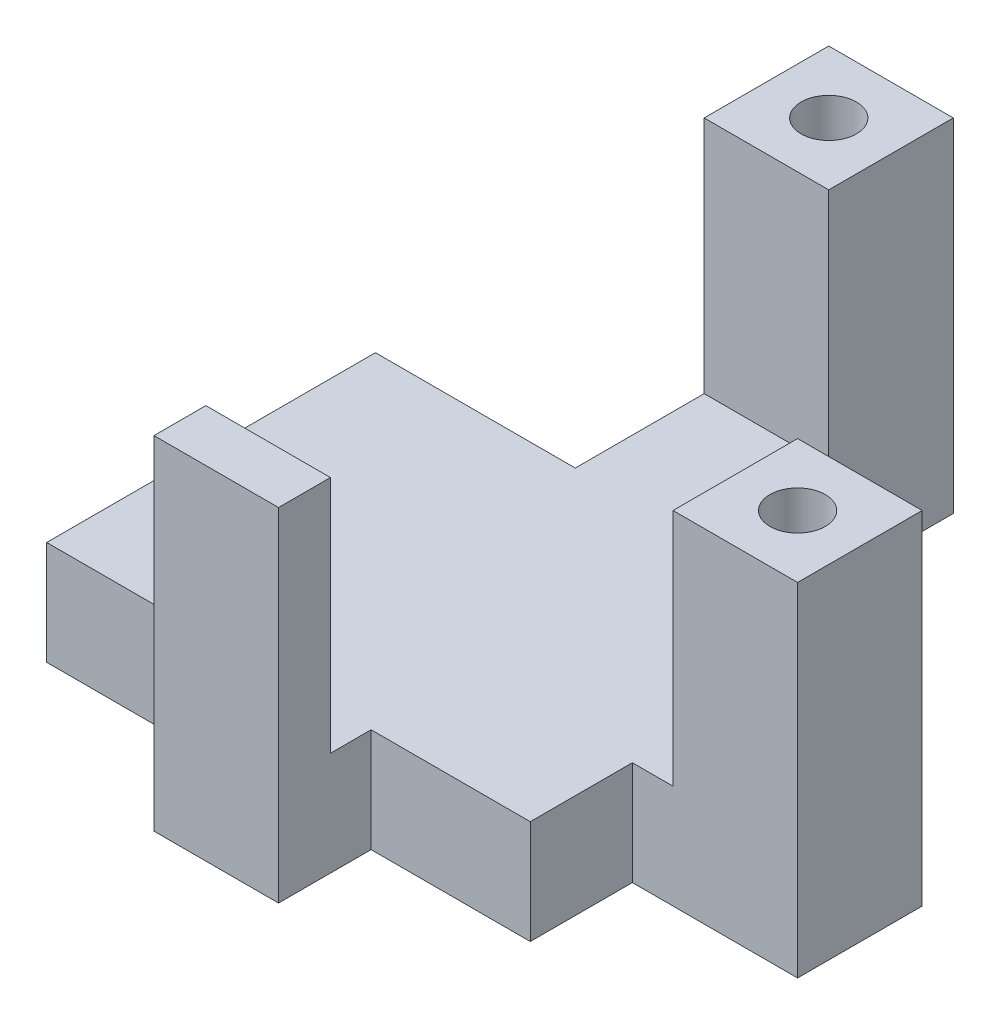
ISO-10303-21;
HEADER;
FILE_DESCRIPTION(('STEP AP214'),'2;1');
FILE_NAME('part.step','',(''),(''),'','','');
FILE_SCHEMA(('AUTOMOTIVE_DESIGN { 1 0 10303 214 1 1 1 1 }'));
ENDSEC;
DATA;
#1=APPLICATION_CONTEXT('core data for automotive mechanical design processes');
#2=APPLICATION_PROTOCOL_DEFINITION('international standard','automotive_design',2000,#1);
#3=PRODUCT_CONTEXT('',#1,'mechanical');
#4=PRODUCT('Part','Part','',(#3));
#5=PRODUCT_RELATED_PRODUCT_CATEGORY('part','',(#4));
#6=PRODUCT_DEFINITION_FORMATION('','',#4);
#7=PRODUCT_DEFINITION_CONTEXT('part definition',#1,'design');
#8=PRODUCT_DEFINITION('design','',#6,#7);
#9=PRODUCT_DEFINITION_SHAPE('','',#8);
#10=(LENGTH_UNIT() NAMED_UNIT(*) SI_UNIT(.MILLI.,.METRE.));
#11=(NAMED_UNIT(*) PLANE_ANGLE_UNIT() SI_UNIT($,.RADIAN.));
#12=(NAMED_UNIT(*) SI_UNIT($,.STERADIAN.) SOLID_ANGLE_UNIT());
#13=UNCERTAINTY_MEASURE_WITH_UNIT(LENGTH_MEASURE(1.E-05),#10,'distance_accuracy_value','');
#14=(GEOMETRIC_REPRESENTATION_CONTEXT(3) GLOBAL_UNCERTAINTY_ASSIGNED_CONTEXT((#13)) GLOBAL_UNIT_ASSIGNED_CONTEXT((#10,
#11,#12)) REPRESENTATION_CONTEXT('',''));
#15=CARTESIAN_POINT('',(0.,0.,0.));
#16=DIRECTION('',(0.,0.,1.));
#17=DIRECTION('',(1.,0.,0.));
#18=AXIS2_PLACEMENT_3D('',#15,#16,#17);
#19=CARTESIAN_POINT('',(34.75,-16.8,0.));
#20=DIRECTION('',(0.,-1.,0.));
#21=DIRECTION('',(1.,0.,0.));
#22=AXIS2_PLACEMENT_3D('',#19,#20,#21);
#23=PLANE('',#22);
#24=DIRECTION('',(0.,0.,1.));
#25=VECTOR('',#24,1.);
#26=CARTESIAN_POINT('',(65.05,-16.8,5.9));
#27=LINE('',#26,#25);
#28=CARTESIAN_POINT('',(65.05,-16.8,5.9));
#29=VERTEX_POINT('',#28);
#30=CARTESIAN_POINT('',(65.05,-16.8,13.1));
#31=VERTEX_POINT('',#30);
#32=EDGE_CURVE('E193',#29,#31,#27,.T.);
#33=ORIENTED_EDGE('',*,*,#32,.F.);
#34=DIRECTION('',(-1.,0.,0.));
#35=VECTOR('',#34,1.);
#36=CARTESIAN_POINT('',(72.25,-16.8,5.9));
#37=LINE('',#36,#35);
#38=CARTESIAN_POINT('',(62.7,-16.8,5.9));
#39=VERTEX_POINT('',#38);
#40=EDGE_CURVE('E228',#29,#39,#37,.T.);
#41=ORIENTED_EDGE('',*,*,#40,.T.);
#42=DIRECTION('',(0.,0.,1.));
#43=VECTOR('',#42,1.);
#44=CARTESIAN_POINT('',(62.7,-16.8,19.));
#45=LINE('',#44,#43);
#46=CARTESIAN_POINT('',(62.7,-16.8,0.));
#47=VERTEX_POINT('',#46);
#48=EDGE_CURVE('E244',#47,#39,#45,.T.);
#49=ORIENTED_EDGE('',*,*,#48,.F.);
#50=DIRECTION('',(1.,0.,0.));
#51=VECTOR('',#50,1.);
#52=CARTESIAN_POINT('',(34.75,-16.8,0.));
#53=LINE('',#52,#51);
#54=CARTESIAN_POINT('',(53.5,-16.8,0.));
#55=VERTEX_POINT('',#54);
#56=EDGE_CURVE('E44',#55,#47,#53,.T.);
#57=ORIENTED_EDGE('',*,*,#56,.F.);
#58=DIRECTION('',(0.,0.,1.));
#59=VECTOR('',#58,1.);
#60=CARTESIAN_POINT('',(53.5,-16.8,0.));
#61=LINE('',#60,#59);
#62=CARTESIAN_POINT('',(53.5,-16.8,-7.45));
#63=VERTEX_POINT('',#62);
#64=EDGE_CURVE('E267',#63,#55,#61,.T.);
#65=ORIENTED_EDGE('',*,*,#64,.F.);
#66=DIRECTION('',(1.,0.,0.));
#67=VECTOR('',#66,1.);
#68=CARTESIAN_POINT('',(48.4,-16.8,-7.45));
#69=LINE('',#68,#67);
#70=CARTESIAN_POINT('',(46.3,-16.8,-7.45));
#71=VERTEX_POINT('',#70);
#72=EDGE_CURVE('E330',#71,#63,#69,.T.);
#73=ORIENTED_EDGE('',*,*,#72,.F.);
#74=DIRECTION('',(0.,0.,-1.));
#75=VECTOR('',#74,1.);
#76=CARTESIAN_POINT('',(46.3,-16.8,0.));
#77=LINE('',#76,#75);
#78=CARTESIAN_POINT('',(46.3,-16.8,0.));
#79=VERTEX_POINT('',#78);
#80=EDGE_CURVE('E316',#79,#71,#77,.T.);
#81=ORIENTED_EDGE('',*,*,#80,.F.);
#82=CARTESIAN_POINT('',(34.75,-16.8,0.));
#83=VERTEX_POINT('',#82);
#84=EDGE_CURVE('E11',#83,#79,#53,.T.);
#85=ORIENTED_EDGE('',*,*,#84,.F.);
#86=DIRECTION('',(0.,0.,-1.));
#87=VECTOR('',#86,1.);
#88=CARTESIAN_POINT('',(34.75,-16.8,0.));
#89=LINE('',#88,#87);
#90=CARTESIAN_POINT('',(34.75,-16.8,19.));
#91=VERTEX_POINT('',#90);
#92=EDGE_CURVE('E351',#91,#83,#89,.T.);
#93=ORIENTED_EDGE('',*,*,#92,.F.);
#94=DIRECTION('',(-1.,0.,0.));
#95=VECTOR('',#94,1.);
#96=CARTESIAN_POINT('',(34.75,-16.8,19.));
#97=LINE('',#96,#95);
#98=CARTESIAN_POINT('',(46.3,-16.8,19.));
#99=VERTEX_POINT('',#98);
#100=EDGE_CURVE('E344',#99,#91,#97,.T.);
#101=ORIENTED_EDGE('',*,*,#100,.F.);
#102=DIRECTION('',(0.,0.,-1.));
#103=VECTOR('',#102,1.);
#104=CARTESIAN_POINT('',(46.3,-16.8,21.35));
#105=LINE('',#104,#103);
#106=CARTESIAN_POINT('',(46.3,-16.8,21.35));
#107=VERTEX_POINT('',#106);
#108=EDGE_CURVE('E300',#107,#99,#105,.T.);
#109=ORIENTED_EDGE('',*,*,#108,.F.);
#110=DIRECTION('',(-1.,0.,0.));
#111=VECTOR('',#110,1.);
#112=CARTESIAN_POINT('',(48.4,-16.8,21.35));
#113=LINE('',#112,#111);
#114=CARTESIAN_POINT('',(53.5,-16.8,21.35));
#115=VERTEX_POINT('',#114);
#116=EDGE_CURVE('E324',#115,#107,#113,.T.);
#117=ORIENTED_EDGE('',*,*,#116,.F.);
#118=DIRECTION('',(0.,0.,1.));
#119=VECTOR('',#118,1.);
#120=CARTESIAN_POINT('',(53.5,-16.8,19.));
#121=LINE('',#120,#119);
#122=CARTESIAN_POINT('',(53.5,-16.8,19.));
#123=VERTEX_POINT('',#122);
#124=EDGE_CURVE('E288',#123,#115,#121,.T.);
#125=ORIENTED_EDGE('',*,*,#124,.F.);
#126=CARTESIAN_POINT('',(62.7,-16.8,19.));
#127=VERTEX_POINT('',#126);
#128=EDGE_CURVE('E345',#127,#123,#97,.T.);
#129=ORIENTED_EDGE('',*,*,#128,.F.);
#130=CARTESIAN_POINT('',(62.7,-16.8,13.1));
#131=VERTEX_POINT('',#130);
#132=EDGE_CURVE('E243',#131,#127,#45,.T.);
#133=ORIENTED_EDGE('',*,*,#132,.F.);
#134=DIRECTION('',(-1.,0.,0.));
#135=VECTOR('',#134,1.);
#136=CARTESIAN_POINT('',(72.25,-16.8,13.1));
#137=LINE('',#136,#135);
#138=EDGE_CURVE('E51',#31,#131,#137,.T.);
#139=ORIENTED_EDGE('',*,*,#138,.F.);
#140=EDGE_LOOP('',(#33,#41,#49,#57,#65,#73,#81,#85,#93,#101,#109,#117,#125,#129,#133,#139));
#141=FACE_BOUND('',#140,.T.);
#142=ADVANCED_FACE('F36',(#141),#23,.F.);
#143=CARTESIAN_POINT('',(62.7,0.,0.));
#144=DIRECTION('',(1.,0.,0.));
#145=DIRECTION('',(0.,0.,-1.));
#146=AXIS2_PLACEMENT_3D('',#143,#144,#145);
#147=PLANE('',#146);
#148=DIRECTION('',(0.,-1.,0.));
#149=VECTOR('',#148,1.);
#150=CARTESIAN_POINT('',(62.7,-16.8,13.1));
#151=LINE('',#150,#149);
#152=CARTESIAN_POINT('',(62.7,-22.8,13.1));
#153=VERTEX_POINT('',#152);
#154=EDGE_CURVE('E210',#131,#153,#151,.T.);
#155=ORIENTED_EDGE('',*,*,#154,.F.);
#156=ORIENTED_EDGE('',*,*,#132,.T.);
#157=DIRECTION('',(0.,-1.,0.));
#158=VECTOR('',#157,1.);
#159=CARTESIAN_POINT('',(62.7,-16.8,19.));
#160=LINE('',#159,#158);
#161=CARTESIAN_POINT('',(62.7,-22.8,19.));
#162=VERTEX_POINT('',#161);
#163=EDGE_CURVE('E236',#127,#162,#160,.T.);
#164=ORIENTED_EDGE('',*,*,#163,.T.);
#165=DIRECTION('',(0.,0.,-1.));
#166=VECTOR('',#165,1.);
#167=CARTESIAN_POINT('',(62.7,-22.8,19.));
#168=LINE('',#167,#166);
#169=EDGE_CURVE('E239',#162,#153,#168,.T.);
#170=ORIENTED_EDGE('',*,*,#169,.T.);
#171=EDGE_LOOP('',(#155,#156,#164,#170));
#172=FACE_BOUND('',#171,.T.);
#173=ADVANCED_FACE('F429',(#172),#147,.T.);
#174=CARTESIAN_POINT('',(0.,0.,0.));
#175=DIRECTION('',(0.,0.,-1.));
#176=DIRECTION('',(-1.,0.,0.));
#177=AXIS2_PLACEMENT_3D('',#174,#175,#176);
#178=PLANE('',#177);
#179=ORIENTED_EDGE('',*,*,#56,.T.);
#180=DIRECTION('',(0.,1.,0.));
#181=VECTOR('',#180,1.);
#182=CARTESIAN_POINT('',(62.7,-16.8,0.));
#183=LINE('',#182,#181);
#184=CARTESIAN_POINT('',(62.7,-22.8,0.));
#185=VERTEX_POINT('',#184);
#186=EDGE_CURVE('E241',#185,#47,#183,.T.);
#187=ORIENTED_EDGE('',*,*,#186,.F.);
#188=DIRECTION('',(1.,0.,0.));
#189=VECTOR('',#188,1.);
#190=CARTESIAN_POINT('',(34.75,-22.8,0.));
#191=LINE('',#190,#189);
#192=CARTESIAN_POINT('',(53.5,-22.8,0.));
#193=VERTEX_POINT('',#192);
#194=EDGE_CURVE('E337',#193,#185,#191,.T.);
#195=ORIENTED_EDGE('',*,*,#194,.F.);
#196=DIRECTION('',(0.,-1.,0.));
#197=VECTOR('',#196,1.);
#198=CARTESIAN_POINT('',(53.5,-22.8,0.));
#199=LINE('',#198,#197);
#200=EDGE_CURVE('E269',#55,#193,#199,.T.);
#201=ORIENTED_EDGE('',*,*,#200,.F.);
#202=EDGE_LOOP('',(#179,#187,#195,#201));
#203=FACE_BOUND('',#202,.T.);
#204=ADVANCED_FACE('F361',(#203),#178,.T.);
#205=CARTESIAN_POINT('',(0.,0.,19.));
#206=DIRECTION('',(0.,0.,-1.));
#207=DIRECTION('',(-1.,0.,0.));
#208=AXIS2_PLACEMENT_3D('',#205,#206,#207);
#209=PLANE('',#208);
#210=ORIENTED_EDGE('',*,*,#163,.F.);
#211=ORIENTED_EDGE('',*,*,#128,.T.);
#212=DIRECTION('',(0.,1.,0.));
#213=VECTOR('',#212,1.);
#214=CARTESIAN_POINT('',(53.5,-22.8,19.));
#215=LINE('',#214,#213);
#216=CARTESIAN_POINT('',(53.5,-22.8,19.));
#217=VERTEX_POINT('',#216);
#218=EDGE_CURVE('E285',#217,#123,#215,.T.);
#219=ORIENTED_EDGE('',*,*,#218,.F.);
#220=DIRECTION('',(-1.,0.,0.));
#221=VECTOR('',#220,1.);
#222=CARTESIAN_POINT('',(34.75,-22.8,19.));
#223=LINE('',#222,#221);
#224=EDGE_CURVE('E342',#162,#217,#223,.T.);
#225=ORIENTED_EDGE('',*,*,#224,.F.);
#226=EDGE_LOOP('',(#210,#211,#219,#225));
#227=FACE_BOUND('',#226,.T.);
#228=ADVANCED_FACE('F425',(#227),#209,.F.);
#229=CARTESIAN_POINT('',(0.,-22.8,0.));
#230=DIRECTION('',(0.,-1.,0.));
#231=DIRECTION('',(1.,0.,0.));
#232=AXIS2_PLACEMENT_3D('',#229,#230,#231);
#233=PLANE('',#232);
#234=CARTESIAN_POINT('',(68.65,-22.8,9.5));
#235=DIRECTION('',(0.,-1.,0.));
#236=DIRECTION('',(1.,0.,0.));
#237=AXIS2_PLACEMENT_3D('',#234,#235,#236);
#238=CIRCLE('',#237,1.6);
#239=CARTESIAN_POINT('',(68.65,-22.8,11.1));
#240=VERTEX_POINT('',#239);
#241=EDGE_CURVE('E219',#240,#240,#238,.F.);
#242=ORIENTED_EDGE('',*,*,#241,.T.);
#243=EDGE_LOOP('',(#242));
#244=FACE_BOUND('',#243,.T.);
#245=CARTESIAN_POINT('',(49.9,-22.8,-11.05));
#246=DIRECTION('',(0.,-1.,0.));
#247=DIRECTION('',(1.,0.,0.));
#248=AXIS2_PLACEMENT_3D('',#245,#246,#247);
#249=CIRCLE('',#248,1.6);
#250=CARTESIAN_POINT('',(51.5,-22.8,-11.05));
#251=VERTEX_POINT('',#250);
#252=EDGE_CURVE('E246',#251,#251,#249,.T.);
#253=ORIENTED_EDGE('',*,*,#252,.F.);
#254=EDGE_LOOP('',(#253));
#255=FACE_BOUND('',#254,.T.);
#256=ORIENTED_EDGE('',*,*,#194,.T.);
#257=CARTESIAN_POINT('',(62.7,-22.8,5.9));
#258=VERTEX_POINT('',#257);
#259=EDGE_CURVE('E238',#258,#185,#168,.T.);
#260=ORIENTED_EDGE('',*,*,#259,.F.);
#261=DIRECTION('',(-1.,0.,0.));
#262=VECTOR('',#261,1.);
#263=CARTESIAN_POINT('',(72.25,-22.8,5.9));
#264=LINE('',#263,#262);
#265=CARTESIAN_POINT('',(72.25,-22.8,5.9));
#266=VERTEX_POINT('',#265);
#267=EDGE_CURVE('E230',#266,#258,#264,.T.);
#268=ORIENTED_EDGE('',*,*,#267,.F.);
#269=DIRECTION('',(0.,0.,-1.));
#270=VECTOR('',#269,1.);
#271=CARTESIAN_POINT('',(72.25,-22.8,13.1));
#272=LINE('',#271,#270);
#273=CARTESIAN_POINT('',(72.25,-22.8,13.1));
#274=VERTEX_POINT('',#273);
#275=EDGE_CURVE('E222',#274,#266,#272,.T.);
#276=ORIENTED_EDGE('',*,*,#275,.F.);
#277=DIRECTION('',(-1.,0.,0.));
#278=VECTOR('',#277,1.);
#279=CARTESIAN_POINT('',(72.25,-22.8,13.1));
#280=LINE('',#279,#278);
#281=EDGE_CURVE('E233',#274,#153,#280,.T.);
#282=ORIENTED_EDGE('',*,*,#281,.T.);
#283=ORIENTED_EDGE('',*,*,#169,.F.);
#284=ORIENTED_EDGE('',*,*,#224,.T.);
#285=DIRECTION('',(0.,0.,-1.));
#286=VECTOR('',#285,1.);
#287=CARTESIAN_POINT('',(53.5,-22.8,24.35));
#288=LINE('',#287,#286);
#289=CARTESIAN_POINT('',(53.5,-22.8,24.35));
#290=VERTEX_POINT('',#289);
#291=EDGE_CURVE('E282',#290,#217,#288,.T.);
#292=ORIENTED_EDGE('',*,*,#291,.F.);
#293=DIRECTION('',(1.,0.,0.));
#294=VECTOR('',#293,1.);
#295=CARTESIAN_POINT('',(48.4,-22.8,24.35));
#296=LINE('',#295,#294);
#297=CARTESIAN_POINT('',(46.3,-22.8,24.35));
#298=VERTEX_POINT('',#297);
#299=EDGE_CURVE('E328',#298,#290,#296,.T.);
#300=ORIENTED_EDGE('',*,*,#299,.F.);
#301=DIRECTION('',(0.,0.,1.));
#302=VECTOR('',#301,1.);
#303=CARTESIAN_POINT('',(46.3,-22.8,19.));
#304=LINE('',#303,#302);
#305=CARTESIAN_POINT('',(46.3,-22.8,19.));
#306=VERTEX_POINT('',#305);
#307=EDGE_CURVE('E304',#306,#298,#304,.T.);
#308=ORIENTED_EDGE('',*,*,#307,.F.);
#309=CARTESIAN_POINT('',(34.75,-22.8,19.));
#310=VERTEX_POINT('',#309);
#311=EDGE_CURVE('E341',#306,#310,#223,.T.);
#312=ORIENTED_EDGE('',*,*,#311,.T.);
#313=DIRECTION('',(0.,0.,-1.));
#314=VECTOR('',#313,1.);
#315=CARTESIAN_POINT('',(34.75,-22.8,19.));
#316=LINE('',#315,#314);
#317=CARTESIAN_POINT('',(34.75,-22.8,0.));
#318=VERTEX_POINT('',#317);
#319=EDGE_CURVE('E334',#310,#318,#316,.T.);
#320=ORIENTED_EDGE('',*,*,#319,.T.);
#321=CARTESIAN_POINT('',(46.3,-22.8,0.));
#322=VERTEX_POINT('',#321);
#323=EDGE_CURVE('E338',#318,#322,#191,.T.);
#324=ORIENTED_EDGE('',*,*,#323,.T.);
#325=DIRECTION('',(0.,0.,1.));
#326=VECTOR('',#325,1.);
#327=CARTESIAN_POINT('',(46.3,-22.8,-10.45));
#328=LINE('',#327,#326);
#329=CARTESIAN_POINT('',(46.3,-22.8,-14.65));
#330=VERTEX_POINT('',#329);
#331=EDGE_CURVE('E312',#330,#322,#328,.T.);
#332=ORIENTED_EDGE('',*,*,#331,.F.);
#333=DIRECTION('',(-1.,0.,0.));
#334=VECTOR('',#333,1.);
#335=CARTESIAN_POINT('',(53.5,-22.8,-14.65));
#336=LINE('',#335,#334);
#337=CARTESIAN_POINT('',(53.5,-22.8,-14.65));
#338=VERTEX_POINT('',#337);
#339=EDGE_CURVE('E255',#338,#330,#336,.T.);
#340=ORIENTED_EDGE('',*,*,#339,.F.);
#341=DIRECTION('',(0.,0.,-1.));
#342=VECTOR('',#341,1.);
#343=CARTESIAN_POINT('',(53.5,-22.8,-10.45));
#344=LINE('',#343,#342);
#345=EDGE_CURVE('E271',#193,#338,#344,.T.);
#346=ORIENTED_EDGE('',*,*,#345,.F.);
#347=EDGE_LOOP('',(#256,#260,#268,#276,#282,#283,#284,#292,#300,#308,#312,#320,#324,#332,#340,#346));
#348=FACE_BOUND('',#347,.T.);
#349=ADVANCED_FACE('F374',(#244,#255,#348),#233,.T.);
#350=CARTESIAN_POINT('',(0.,0.,24.35));
#351=DIRECTION('',(0.,0.,1.));
#352=DIRECTION('',(1.,0.,0.));
#353=AXIS2_PLACEMENT_3D('',#350,#351,#352);
#354=PLANE('',#353);
#355=ORIENTED_EDGE('',*,*,#299,.T.);
#356=DIRECTION('',(0.,-1.,0.));
#357=VECTOR('',#356,1.);
#358=CARTESIAN_POINT('',(53.5,-3.,24.35));
#359=LINE('',#358,#357);
#360=CARTESIAN_POINT('',(53.5,-3.,24.35));
#361=VERTEX_POINT('',#360);
#362=EDGE_CURVE('E279',#361,#290,#359,.T.);
#363=ORIENTED_EDGE('',*,*,#362,.F.);
#364=DIRECTION('',(1.,0.,0.));
#365=VECTOR('',#364,1.);
#366=CARTESIAN_POINT('',(48.4,-3.,24.35));
#367=LINE('',#366,#365);
#368=CARTESIAN_POINT('',(46.3,-3.,24.35));
#369=VERTEX_POINT('',#368);
#370=EDGE_CURVE('E322',#369,#361,#367,.T.);
#371=ORIENTED_EDGE('',*,*,#370,.F.);
#372=DIRECTION('',(0.,1.,0.));
#373=VECTOR('',#372,1.);
#374=CARTESIAN_POINT('',(46.3,-22.8,24.35));
#375=LINE('',#374,#373);
#376=EDGE_CURVE('E307',#298,#369,#375,.T.);
#377=ORIENTED_EDGE('',*,*,#376,.F.);
#378=EDGE_LOOP('',(#355,#363,#371,#377));
#379=FACE_BOUND('',#378,.T.);
#380=ADVANCED_FACE('F418',(#379),#354,.T.);
#381=ORIENTED_EDGE('',*,*,#311,.F.);
#382=DIRECTION('',(0.,-1.,0.));
#383=VECTOR('',#382,1.);
#384=CARTESIAN_POINT('',(46.3,-16.8,19.));
#385=LINE('',#384,#383);
#386=EDGE_CURVE('E302',#99,#306,#385,.T.);
#387=ORIENTED_EDGE('',*,*,#386,.F.);
#388=ORIENTED_EDGE('',*,*,#100,.T.);
#389=DIRECTION('',(0.,-1.,0.));
#390=VECTOR('',#389,1.);
#391=CARTESIAN_POINT('',(34.75,-19.8,19.));
#392=LINE('',#391,#390);
#393=EDGE_CURVE('E347',#91,#310,#392,.T.);
#394=ORIENTED_EDGE('',*,*,#393,.T.);
#395=EDGE_LOOP('',(#381,#387,#388,#394));
#396=FACE_BOUND('',#395,.T.);
#397=ADVANCED_FACE('F398',(#396),#209,.F.);
#398=DIRECTION('',(0.,1.,0.));
#399=VECTOR('',#398,1.);
#400=CARTESIAN_POINT('',(46.3,-22.8,0.));
#401=LINE('',#400,#399);
#402=EDGE_CURVE('E314',#322,#79,#401,.T.);
#403=ORIENTED_EDGE('',*,*,#402,.F.);
#404=ORIENTED_EDGE('',*,*,#323,.F.);
#405=DIRECTION('',(0.,-1.,0.));
#406=VECTOR('',#405,1.);
#407=CARTESIAN_POINT('',(34.75,-19.8,0.));
#408=LINE('',#407,#406);
#409=EDGE_CURVE('E350',#83,#318,#408,.T.);
#410=ORIENTED_EDGE('',*,*,#409,.F.);
#411=ORIENTED_EDGE('',*,*,#84,.T.);
#412=EDGE_LOOP('',(#403,#404,#410,#411));
#413=FACE_BOUND('',#412,.T.);
#414=ADVANCED_FACE('F38',(#413),#178,.T.);
#415=CARTESIAN_POINT('',(34.75,0.,0.));
#416=DIRECTION('',(1.,0.,0.));
#417=DIRECTION('',(0.,0.,-1.));
#418=AXIS2_PLACEMENT_3D('',#415,#416,#417);
#419=PLANE('',#418);
#420=ORIENTED_EDGE('',*,*,#409,.T.);
#421=ORIENTED_EDGE('',*,*,#319,.F.);
#422=ORIENTED_EDGE('',*,*,#393,.F.);
#423=ORIENTED_EDGE('',*,*,#92,.T.);
#424=EDGE_LOOP('',(#420,#421,#422,#423));
#425=FACE_BOUND('',#424,.T.);
#426=ADVANCED_FACE('F396',(#425),#419,.F.);
#427=CARTESIAN_POINT('',(48.4,1.24264068711929,-7.45));
#428=DIRECTION('',(0.,0.,-1.));
#429=DIRECTION('',(-1.,0.,0.));
#430=AXIS2_PLACEMENT_3D('',#427,#428,#429);
#431=PLANE('',#430);
#432=DIRECTION('',(1.,0.,0.));
#433=VECTOR('',#432,1.);
#434=CARTESIAN_POINT('',(48.4,-3.,-7.45));
#435=LINE('',#434,#433);
#436=CARTESIAN_POINT('',(46.3,-3.,-7.45));
#437=VERTEX_POINT('',#436);
#438=CARTESIAN_POINT('',(53.5,-3.,-7.45));
#439=VERTEX_POINT('',#438);
#440=EDGE_CURVE('E332',#437,#439,#435,.T.);
#441=ORIENTED_EDGE('',*,*,#440,.F.);
#442=DIRECTION('',(0.,1.,0.));
#443=VECTOR('',#442,1.);
#444=CARTESIAN_POINT('',(46.3,-16.8,-7.45));
#445=LINE('',#444,#443);
#446=EDGE_CURVE('E319',#71,#437,#445,.T.);
#447=ORIENTED_EDGE('',*,*,#446,.F.);
#448=ORIENTED_EDGE('',*,*,#72,.T.);
#449=DIRECTION('',(0.,-1.,0.));
#450=VECTOR('',#449,1.);
#451=CARTESIAN_POINT('',(53.5,-16.8,-7.45));
#452=LINE('',#451,#450);
#453=EDGE_CURVE('E264',#439,#63,#452,.T.);
#454=ORIENTED_EDGE('',*,*,#453,.F.);
#455=EDGE_LOOP('',(#441,#447,#448,#454));
#456=FACE_BOUND('',#455,.T.);
#457=ADVANCED_FACE('F382',(#456),#431,.F.);
#458=CARTESIAN_POINT('',(48.4,1.24264068711928,21.35));
#459=DIRECTION('',(0.,0.,1.));
#460=DIRECTION('',(1.,0.,0.));
#461=AXIS2_PLACEMENT_3D('',#458,#459,#460);
#462=PLANE('',#461);
#463=DIRECTION('',(-1.,0.,0.));
#464=VECTOR('',#463,1.);
#465=CARTESIAN_POINT('',(48.4,-3.,21.35));
#466=LINE('',#465,#464);
#467=CARTESIAN_POINT('',(53.5,-3.,21.35));
#468=VERTEX_POINT('',#467);
#469=CARTESIAN_POINT('',(46.3,-3.,21.35));
#470=VERTEX_POINT('',#469);
#471=EDGE_CURVE('E326',#468,#470,#466,.T.);
#472=ORIENTED_EDGE('',*,*,#471,.F.);
#473=DIRECTION('',(0.,1.,0.));
#474=VECTOR('',#473,1.);
#475=CARTESIAN_POINT('',(53.5,-16.8,21.35));
#476=LINE('',#475,#474);
#477=EDGE_CURVE('E291',#115,#468,#476,.T.);
#478=ORIENTED_EDGE('',*,*,#477,.F.);
#479=ORIENTED_EDGE('',*,*,#116,.T.);
#480=DIRECTION('',(0.,-1.,0.));
#481=VECTOR('',#480,1.);
#482=CARTESIAN_POINT('',(46.3,-3.,21.35));
#483=LINE('',#482,#481);
#484=EDGE_CURVE('E297',#470,#107,#483,.T.);
#485=ORIENTED_EDGE('',*,*,#484,.F.);
#486=EDGE_LOOP('',(#472,#478,#479,#485));
#487=FACE_BOUND('',#486,.T.);
#488=ADVANCED_FACE('F408',(#487),#462,.F.);
#489=CARTESIAN_POINT('',(0.,-3.,0.));
#490=DIRECTION('',(0.,1.,0.));
#491=DIRECTION('',(0.,0.,1.));
#492=AXIS2_PLACEMENT_3D('',#489,#490,#491);
#493=PLANE('',#492);
#494=ORIENTED_EDGE('',*,*,#471,.T.);
#495=DIRECTION('',(0.,0.,-1.));
#496=VECTOR('',#495,1.);
#497=CARTESIAN_POINT('',(46.3,-3.,24.35));
#498=LINE('',#497,#496);
#499=EDGE_CURVE('E294',#369,#470,#498,.T.);
#500=ORIENTED_EDGE('',*,*,#499,.F.);
#501=ORIENTED_EDGE('',*,*,#370,.T.);
#502=DIRECTION('',(0.,0.,1.));
#503=VECTOR('',#502,1.);
#504=CARTESIAN_POINT('',(53.5,-3.,21.35));
#505=LINE('',#504,#503);
#506=EDGE_CURVE('E276',#468,#361,#505,.T.);
#507=ORIENTED_EDGE('',*,*,#506,.F.);
#508=EDGE_LOOP('',(#494,#500,#501,#507));
#509=FACE_BOUND('',#508,.T.);
#510=ADVANCED_FACE('F414',(#509),#493,.T.);
#511=CARTESIAN_POINT('',(0.,-3.,0.));
#512=DIRECTION('',(0.,1.,0.));
#513=DIRECTION('',(0.,0.,1.));
#514=AXIS2_PLACEMENT_3D('',#511,#512,#513);
#515=PLANE('',#514);
#516=CARTESIAN_POINT('',(49.9,-3.,-11.05));
#517=DIRECTION('',(0.,-1.,0.));
#518=DIRECTION('',(1.,0.,0.));
#519=AXIS2_PLACEMENT_3D('',#516,#517,#518);
#520=CIRCLE('',#519,1.6);
#521=CARTESIAN_POINT('',(51.5,-3.,-11.05));
#522=VERTEX_POINT('',#521);
#523=EDGE_CURVE('E247',#522,#522,#520,.T.);
#524=ORIENTED_EDGE('',*,*,#523,.T.);
#525=EDGE_LOOP('',(#524));
#526=FACE_BOUND('',#525,.T.);
#527=ORIENTED_EDGE('',*,*,#440,.T.);
#528=DIRECTION('',(0.,0.,1.));
#529=VECTOR('',#528,1.);
#530=CARTESIAN_POINT('',(53.5,-3.,-7.45));
#531=LINE('',#530,#529);
#532=CARTESIAN_POINT('',(53.5,-3.,-14.65));
#533=VERTEX_POINT('',#532);
#534=EDGE_CURVE('E273',#533,#439,#531,.T.);
#535=ORIENTED_EDGE('',*,*,#534,.F.);
#536=DIRECTION('',(1.,0.,0.));
#537=VECTOR('',#536,1.);
#538=CARTESIAN_POINT('',(53.5,-3.,-14.65));
#539=LINE('',#538,#537);
#540=CARTESIAN_POINT('',(46.3,-3.,-14.65));
#541=VERTEX_POINT('',#540);
#542=EDGE_CURVE('E261',#541,#533,#539,.T.);
#543=ORIENTED_EDGE('',*,*,#542,.F.);
#544=DIRECTION('',(0.,0.,-1.));
#545=VECTOR('',#544,1.);
#546=CARTESIAN_POINT('',(46.3,-3.,-7.45));
#547=LINE('',#546,#545);
#548=EDGE_CURVE('E310',#437,#541,#547,.T.);
#549=ORIENTED_EDGE('',*,*,#548,.F.);
#550=EDGE_LOOP('',(#527,#535,#543,#549));
#551=FACE_BOUND('',#550,.T.);
#552=ADVANCED_FACE('F462',(#526,#551),#515,.T.);
#553=CARTESIAN_POINT('',(46.3,0.,0.));
#554=DIRECTION('',(-1.,0.,0.));
#555=DIRECTION('',(0.,0.,1.));
#556=AXIS2_PLACEMENT_3D('',#553,#554,#555);
#557=PLANE('',#556);
#558=ORIENTED_EDGE('',*,*,#548,.T.);
#559=DIRECTION('',(0.,1.,0.));
#560=VECTOR('',#559,1.);
#561=CARTESIAN_POINT('',(46.3,-3.,-14.65));
#562=LINE('',#561,#560);
#563=EDGE_CURVE('E258',#330,#541,#562,.T.);
#564=ORIENTED_EDGE('',*,*,#563,.F.);
#565=ORIENTED_EDGE('',*,*,#331,.T.);
#566=ORIENTED_EDGE('',*,*,#402,.T.);
#567=ORIENTED_EDGE('',*,*,#80,.T.);
#568=ORIENTED_EDGE('',*,*,#446,.T.);
#569=EDGE_LOOP('',(#558,#564,#565,#566,#567,#568));
#570=FACE_BOUND('',#569,.T.);
#571=ADVANCED_FACE('F386',(#570),#557,.T.);
#572=CARTESIAN_POINT('',(46.3,0.,0.));
#573=DIRECTION('',(-1.,0.,0.));
#574=DIRECTION('',(0.,0.,1.));
#575=AXIS2_PLACEMENT_3D('',#572,#573,#574);
#576=PLANE('',#575);
#577=ORIENTED_EDGE('',*,*,#499,.T.);
#578=ORIENTED_EDGE('',*,*,#484,.T.);
#579=ORIENTED_EDGE('',*,*,#108,.T.);
#580=ORIENTED_EDGE('',*,*,#386,.T.);
#581=ORIENTED_EDGE('',*,*,#307,.T.);
#582=ORIENTED_EDGE('',*,*,#376,.T.);
#583=EDGE_LOOP('',(#577,#578,#579,#580,#581,#582));
#584=FACE_BOUND('',#583,.T.);
#585=ADVANCED_FACE('F404',(#584),#576,.T.);
#586=CARTESIAN_POINT('',(53.5,0.,0.));
#587=DIRECTION('',(1.,0.,0.));
#588=DIRECTION('',(0.,0.,-1.));
#589=AXIS2_PLACEMENT_3D('',#586,#587,#588);
#590=PLANE('',#589);
#591=ORIENTED_EDGE('',*,*,#506,.T.);
#592=ORIENTED_EDGE('',*,*,#362,.T.);
#593=ORIENTED_EDGE('',*,*,#291,.T.);
#594=ORIENTED_EDGE('',*,*,#218,.T.);
#595=ORIENTED_EDGE('',*,*,#124,.T.);
#596=ORIENTED_EDGE('',*,*,#477,.T.);
#597=EDGE_LOOP('',(#591,#592,#593,#594,#595,#596));
#598=FACE_BOUND('',#597,.T.);
#599=ADVANCED_FACE('F412',(#598),#590,.T.);
#600=CARTESIAN_POINT('',(53.5,0.,0.));
#601=DIRECTION('',(-1.,0.,0.));
#602=DIRECTION('',(0.,0.,1.));
#603=AXIS2_PLACEMENT_3D('',#600,#601,#602);
#604=PLANE('',#603);
#605=ORIENTED_EDGE('',*,*,#453,.T.);
#606=ORIENTED_EDGE('',*,*,#64,.T.);
#607=ORIENTED_EDGE('',*,*,#200,.T.);
#608=ORIENTED_EDGE('',*,*,#345,.T.);
#609=DIRECTION('',(0.,-1.,0.));
#610=VECTOR('',#609,1.);
#611=CARTESIAN_POINT('',(53.5,-3.,-14.65));
#612=LINE('',#611,#610);
#613=EDGE_CURVE('E250',#533,#338,#612,.T.);
#614=ORIENTED_EDGE('',*,*,#613,.F.);
#615=ORIENTED_EDGE('',*,*,#534,.T.);
#616=EDGE_LOOP('',(#605,#606,#607,#608,#614,#615));
#617=FACE_BOUND('',#616,.T.);
#618=ADVANCED_FACE('F379',(#617),#604,.F.);
#619=CARTESIAN_POINT('',(0.,0.,-14.65));
#620=DIRECTION('',(0.,0.,-1.));
#621=DIRECTION('',(-1.,0.,0.));
#622=AXIS2_PLACEMENT_3D('',#619,#620,#621);
#623=PLANE('',#622);
#624=ORIENTED_EDGE('',*,*,#613,.T.);
#625=ORIENTED_EDGE('',*,*,#339,.T.);
#626=ORIENTED_EDGE('',*,*,#563,.T.);
#627=ORIENTED_EDGE('',*,*,#542,.T.);
#628=EDGE_LOOP('',(#624,#625,#626,#627));
#629=FACE_BOUND('',#628,.T.);
#630=ADVANCED_FACE('F444',(#629),#623,.T.);
#631=CARTESIAN_POINT('',(49.9,-3.,-11.05));
#632=DIRECTION('',(0.,-1.,0.));
#633=DIRECTION('',(1.,0.,0.));
#634=AXIS2_PLACEMENT_3D('',#631,#632,#633);
#635=CYLINDRICAL_SURFACE('',#634,1.6);
#636=ORIENTED_EDGE('',*,*,#523,.F.);
#637=EDGE_LOOP('',(#636));
#638=FACE_BOUND('',#637,.T.);
#639=ORIENTED_EDGE('',*,*,#252,.T.);
#640=EDGE_LOOP('',(#639));
#641=FACE_BOUND('',#640,.T.);
#642=ADVANCED_FACE('F439',(#638,#641),#635,.F.);
#643=DIRECTION('',(0.,1.,0.));
#644=VECTOR('',#643,1.);
#645=CARTESIAN_POINT('',(62.7,-16.8,5.9));
#646=LINE('',#645,#644);
#647=EDGE_CURVE('E59',#258,#39,#646,.T.);
#648=ORIENTED_EDGE('',*,*,#647,.F.);
#649=ORIENTED_EDGE('',*,*,#259,.T.);
#650=ORIENTED_EDGE('',*,*,#186,.T.);
#651=ORIENTED_EDGE('',*,*,#48,.T.);
#652=EDGE_LOOP('',(#648,#649,#650,#651));
#653=FACE_BOUND('',#652,.T.);
#654=ADVANCED_FACE('F368',(#653),#147,.T.);
#655=CARTESIAN_POINT('',(72.25,-16.8,13.1));
#656=DIRECTION('',(0.,0.,-1.));
#657=DIRECTION('',(-1.,0.,0.));
#658=AXIS2_PLACEMENT_3D('',#655,#656,#657);
#659=PLANE('',#658);
#660=ORIENTED_EDGE('',*,*,#154,.T.);
#661=ORIENTED_EDGE('',*,*,#281,.F.);
#662=DIRECTION('',(0.,-1.,0.));
#663=VECTOR('',#662,1.);
#664=CARTESIAN_POINT('',(72.25,-16.8,13.1));
#665=LINE('',#664,#663);
#666=CARTESIAN_POINT('',(72.25,-3.,13.1));
#667=VERTEX_POINT('',#666);
#668=EDGE_CURVE('E200',#667,#274,#665,.T.);
#669=ORIENTED_EDGE('',*,*,#668,.F.);
#670=DIRECTION('',(1.,0.,0.));
#671=VECTOR('',#670,1.);
#672=CARTESIAN_POINT('',(72.25,-3.,13.1));
#673=LINE('',#672,#671);
#674=CARTESIAN_POINT('',(65.05,-3.,13.1));
#675=VERTEX_POINT('',#674);
#676=EDGE_CURVE('E194',#675,#667,#673,.T.);
#677=ORIENTED_EDGE('',*,*,#676,.F.);
#678=DIRECTION('',(0.,-1.,0.));
#679=VECTOR('',#678,1.);
#680=CARTESIAN_POINT('',(65.05,7.18233764908629,13.1));
#681=LINE('',#680,#679);
#682=EDGE_CURVE('E186',#675,#31,#681,.T.);
#683=ORIENTED_EDGE('',*,*,#682,.T.);
#684=ORIENTED_EDGE('',*,*,#138,.T.);
#685=EDGE_LOOP('',(#660,#661,#669,#677,#683,#684));
#686=FACE_BOUND('',#685,.T.);
#687=ADVANCED_FACE('F197',(#686),#659,.F.);
#688=CARTESIAN_POINT('',(72.25,-16.8,5.9));
#689=DIRECTION('',(0.,0.,1.));
#690=DIRECTION('',(1.,0.,0.));
#691=AXIS2_PLACEMENT_3D('',#688,#689,#690);
#692=PLANE('',#691);
#693=ORIENTED_EDGE('',*,*,#647,.T.);
#694=ORIENTED_EDGE('',*,*,#40,.F.);
#695=DIRECTION('',(0.,-1.,0.));
#696=VECTOR('',#695,1.);
#697=CARTESIAN_POINT('',(65.05,7.18233764908629,5.9));
#698=LINE('',#697,#696);
#699=CARTESIAN_POINT('',(65.05,-3.,5.9));
#700=VERTEX_POINT('',#699);
#701=EDGE_CURVE('E218',#700,#29,#698,.T.);
#702=ORIENTED_EDGE('',*,*,#701,.F.);
#703=DIRECTION('',(-1.,0.,0.));
#704=VECTOR('',#703,1.);
#705=CARTESIAN_POINT('',(72.25,-3.,5.9));
#706=LINE('',#705,#704);
#707=CARTESIAN_POINT('',(72.25,-3.,5.9));
#708=VERTEX_POINT('',#707);
#709=EDGE_CURVE('E209',#708,#700,#706,.T.);
#710=ORIENTED_EDGE('',*,*,#709,.F.);
#711=DIRECTION('',(0.,1.,0.));
#712=VECTOR('',#711,1.);
#713=CARTESIAN_POINT('',(72.25,-16.8,5.9));
#714=LINE('',#713,#712);
#715=EDGE_CURVE('E224',#266,#708,#714,.T.);
#716=ORIENTED_EDGE('',*,*,#715,.F.);
#717=ORIENTED_EDGE('',*,*,#267,.T.);
#718=EDGE_LOOP('',(#693,#694,#702,#710,#716,#717));
#719=FACE_BOUND('',#718,.T.);
#720=ADVANCED_FACE('F370',(#719),#692,.F.);
#721=CARTESIAN_POINT('',(72.25,0.,0.));
#722=DIRECTION('',(1.,0.,0.));
#723=DIRECTION('',(0.,0.,-1.));
#724=AXIS2_PLACEMENT_3D('',#721,#722,#723);
#725=PLANE('',#724);
#726=ORIENTED_EDGE('',*,*,#668,.T.);
#727=ORIENTED_EDGE('',*,*,#275,.T.);
#728=ORIENTED_EDGE('',*,*,#715,.T.);
#729=DIRECTION('',(0.,0.,-1.));
#730=VECTOR('',#729,1.);
#731=CARTESIAN_POINT('',(72.25,-3.,5.9));
#732=LINE('',#731,#730);
#733=EDGE_CURVE('E204',#667,#708,#732,.T.);
#734=ORIENTED_EDGE('',*,*,#733,.F.);
#735=EDGE_LOOP('',(#726,#727,#728,#734));
#736=FACE_BOUND('',#735,.T.);
#737=ADVANCED_FACE('F737',(#736),#725,.T.);
#738=CARTESIAN_POINT('',(65.05,7.18233764908629,5.9));
#739=DIRECTION('',(1.,0.,0.));
#740=DIRECTION('',(0.,1.,0.));
#741=AXIS2_PLACEMENT_3D('',#738,#739,#740);
#742=PLANE('',#741);
#743=DIRECTION('',(0.,0.,1.));
#744=VECTOR('',#743,1.);
#745=CARTESIAN_POINT('',(65.05,-3.,5.9));
#746=LINE('',#745,#744);
#747=EDGE_CURVE('E190',#700,#675,#746,.T.);
#748=ORIENTED_EDGE('',*,*,#747,.F.);
#749=ORIENTED_EDGE('',*,*,#701,.T.);
#750=ORIENTED_EDGE('',*,*,#32,.T.);
#751=ORIENTED_EDGE('',*,*,#682,.F.);
#752=EDGE_LOOP('',(#748,#749,#750,#751));
#753=FACE_BOUND('',#752,.T.);
#754=ADVANCED_FACE('F188',(#753),#742,.F.);
#755=CARTESIAN_POINT('',(0.,-3.,0.));
#756=DIRECTION('',(0.,1.,0.));
#757=DIRECTION('',(0.,0.,1.));
#758=AXIS2_PLACEMENT_3D('',#755,#756,#757);
#759=PLANE('',#758);
#760=CARTESIAN_POINT('',(68.65,-3.,9.5));
#761=DIRECTION('',(0.,1.,0.));
#762=DIRECTION('',(0.,0.,1.));
#763=AXIS2_PLACEMENT_3D('',#760,#761,#762);
#764=CIRCLE('',#763,1.6);
#765=CARTESIAN_POINT('',(68.65,-3.,11.1));
#766=VERTEX_POINT('',#765);
#767=EDGE_CURVE('E830',#766,#766,#764,.T.);
#768=ORIENTED_EDGE('',*,*,#767,.F.);
#769=EDGE_LOOP('',(#768));
#770=FACE_BOUND('',#769,.T.);
#771=ORIENTED_EDGE('',*,*,#676,.T.);
#772=ORIENTED_EDGE('',*,*,#733,.T.);
#773=ORIENTED_EDGE('',*,*,#709,.T.);
#774=ORIENTED_EDGE('',*,*,#747,.T.);
#775=EDGE_LOOP('',(#771,#772,#773,#774));
#776=FACE_BOUND('',#775,.T.);
#777=ADVANCED_FACE('F207',(#770,#776),#759,.T.);
#778=CARTESIAN_POINT('',(68.65,-27.3254833995939,9.5));
#779=DIRECTION('',(0.,1.,0.));
#780=DIRECTION('',(0.,0.,1.));
#781=AXIS2_PLACEMENT_3D('',#778,#779,#780);
#782=CYLINDRICAL_SURFACE('',#781,1.6);
#783=CARTESIAN_POINT('',(68.65,-3.,11.1));
#784=CARTESIAN_POINT('',(68.65,-3.20625,11.1));
#785=CARTESIAN_POINT('',(68.65,-3.4125,11.1));
#786=CARTESIAN_POINT('',(68.65,-3.825,11.1));
#787=CARTESIAN_POINT('',(68.65,-4.03125,11.1));
#788=CARTESIAN_POINT('',(68.65,-4.44375,11.1));
#789=CARTESIAN_POINT('',(68.65,-4.65,11.1));
#790=CARTESIAN_POINT('',(68.65,-5.0625,11.1));
#791=CARTESIAN_POINT('',(68.65,-5.26875,11.1));
#792=CARTESIAN_POINT('',(68.65,-5.68125,11.1));
#793=CARTESIAN_POINT('',(68.65,-5.8875,11.1));
#794=CARTESIAN_POINT('',(68.65,-6.3,11.1));
#795=CARTESIAN_POINT('',(68.65,-6.50625,11.1));
#796=CARTESIAN_POINT('',(68.65,-6.91875,11.1));
#797=CARTESIAN_POINT('',(68.65,-7.125,11.1));
#798=CARTESIAN_POINT('',(68.65,-7.5375,11.1));
#799=CARTESIAN_POINT('',(68.65,-7.74375,11.1));
#800=CARTESIAN_POINT('',(68.65,-8.15625,11.1));
#801=CARTESIAN_POINT('',(68.65,-8.3625,11.1));
#802=CARTESIAN_POINT('',(68.65,-8.775,11.1));
#803=CARTESIAN_POINT('',(68.65,-8.98125,11.1));
#804=CARTESIAN_POINT('',(68.65,-9.39375,11.1));
#805=CARTESIAN_POINT('',(68.65,-9.6,11.1));
#806=CARTESIAN_POINT('',(68.65,-10.0125,11.1));
#807=CARTESIAN_POINT('',(68.65,-10.21875,11.1));
#808=CARTESIAN_POINT('',(68.65,-10.63125,11.1));
#809=CARTESIAN_POINT('',(68.65,-10.8375,11.1));
#810=CARTESIAN_POINT('',(68.65,-11.25,11.1));
#811=CARTESIAN_POINT('',(68.65,-11.45625,11.1));
#812=CARTESIAN_POINT('',(68.65,-11.86875,11.1));
#813=CARTESIAN_POINT('',(68.65,-12.075,11.1));
#814=CARTESIAN_POINT('',(68.65,-12.4875,11.1));
#815=CARTESIAN_POINT('',(68.65,-12.69375,11.1));
#816=CARTESIAN_POINT('',(68.65,-13.10625,11.1));
#817=CARTESIAN_POINT('',(68.65,-13.3125,11.1));
#818=CARTESIAN_POINT('',(68.65,-13.725,11.1));
#819=CARTESIAN_POINT('',(68.65,-13.93125,11.1));
#820=CARTESIAN_POINT('',(68.65,-14.34375,11.1));
#821=CARTESIAN_POINT('',(68.65,-14.55,11.1));
#822=CARTESIAN_POINT('',(68.65,-14.9625,11.1));
#823=CARTESIAN_POINT('',(68.65,-15.16875,11.1));
#824=CARTESIAN_POINT('',(68.65,-15.58125,11.1));
#825=CARTESIAN_POINT('',(68.65,-15.7875,11.1));
#826=CARTESIAN_POINT('',(68.65,-16.2,11.1));
#827=CARTESIAN_POINT('',(68.65,-16.40625,11.1));
#828=CARTESIAN_POINT('',(68.65,-16.81875,11.1));
#829=CARTESIAN_POINT('',(68.65,-17.025,11.1));
#830=CARTESIAN_POINT('',(68.65,-17.4375,11.1));
#831=CARTESIAN_POINT('',(68.65,-17.64375,11.1));
#832=CARTESIAN_POINT('',(68.65,-18.05625,11.1));
#833=CARTESIAN_POINT('',(68.65,-18.2625,11.1));
#834=CARTESIAN_POINT('',(68.65,-18.675,11.1));
#835=CARTESIAN_POINT('',(68.65,-18.88125,11.1));
#836=CARTESIAN_POINT('',(68.65,-19.29375,11.1));
#837=CARTESIAN_POINT('',(68.65,-19.5,11.1));
#838=CARTESIAN_POINT('',(68.65,-19.9125,11.1));
#839=CARTESIAN_POINT('',(68.65,-20.11875,11.1));
#840=CARTESIAN_POINT('',(68.65,-20.53125,11.1));
#841=CARTESIAN_POINT('',(68.65,-20.7375,11.1));
#842=CARTESIAN_POINT('',(68.65,-21.15,11.1));
#843=CARTESIAN_POINT('',(68.65,-21.35625,11.1));
#844=CARTESIAN_POINT('',(68.65,-21.76875,11.1));
#845=CARTESIAN_POINT('',(68.65,-21.975,11.1));
#846=CARTESIAN_POINT('',(68.65,-22.3875,11.1));
#847=CARTESIAN_POINT('',(68.65,-22.59375,11.1));
#848=CARTESIAN_POINT('',(68.65,-22.8,11.1));
#849=B_SPLINE_CURVE_WITH_KNOTS('',3,(#783,#784,#785,#786,#787,#788,#789,#790,#791,#792,#793,
#794,#795,#796,#797,#798,#799,#800,#801,#802,#803,#804,#805,#806,#807,#808,#809,#810,#811,#812,
#813,#814,#815,#816,#817,#818,#819,#820,#821,#822,#823,#824,#825,#826,#827,#828,#829,#830,#831,
#832,#833,#834,#835,#836,#837,#838,#839,#840,#841,#842,#843,#844,#845,#846,#847,#848),
.UNSPECIFIED.,.F.,.F.,(4,2,2,2,2,2,2,2,2,2,2,2,2,2,2,2,2,2,2,2,2,2,2,2,2,2,2,2,2,2,2,2,4),(0.,
0.618750000000001,1.2375,1.85625,2.475,3.09375,3.7125,4.33125,4.95,5.56875,6.1875,6.80625,7.425,
8.04375,8.6625,9.28125,9.9,10.51875,11.1375,11.75625,12.375,12.99375,13.6125,14.23125,14.85,
15.46875,16.0875,16.70625,17.325,17.94375,18.5625,19.18125,19.8),.UNSPECIFIED.);
#850=EDGE_CURVE('BSEAM813',#766,#240,#849,.T.);
#851=ORIENTED_EDGE('',*,*,#767,.T.);
#852=ORIENTED_EDGE('',*,*,#241,.F.);
#853=ORIENTED_EDGE('',*,*,#850,.T.);
#854=ORIENTED_EDGE('',*,*,#850,.F.);
#855=EDGE_LOOP('',(#851,#853,#852,#854));
#856=FACE_BOUND('',#855,.T.);
#857=ADVANCED_FACE('F813',(#856),#782,.F.);
#858=CLOSED_SHELL('',(#142,#173,#204,#228,#349,#380,#397,#414,#426,#457,#488,#510,#552,#571,
#585,#599,#618,#630,#642,#654,#687,#720,#737,#754,#777,#857));
#859=MANIFOLD_SOLID_BREP('B2',#858);
#860=ADVANCED_BREP_SHAPE_REPRESENTATION('',(#18,#859),#14);
#861=SHAPE_DEFINITION_REPRESENTATION(#9,#860);
ENDSEC;
END-ISO-10303-21;
